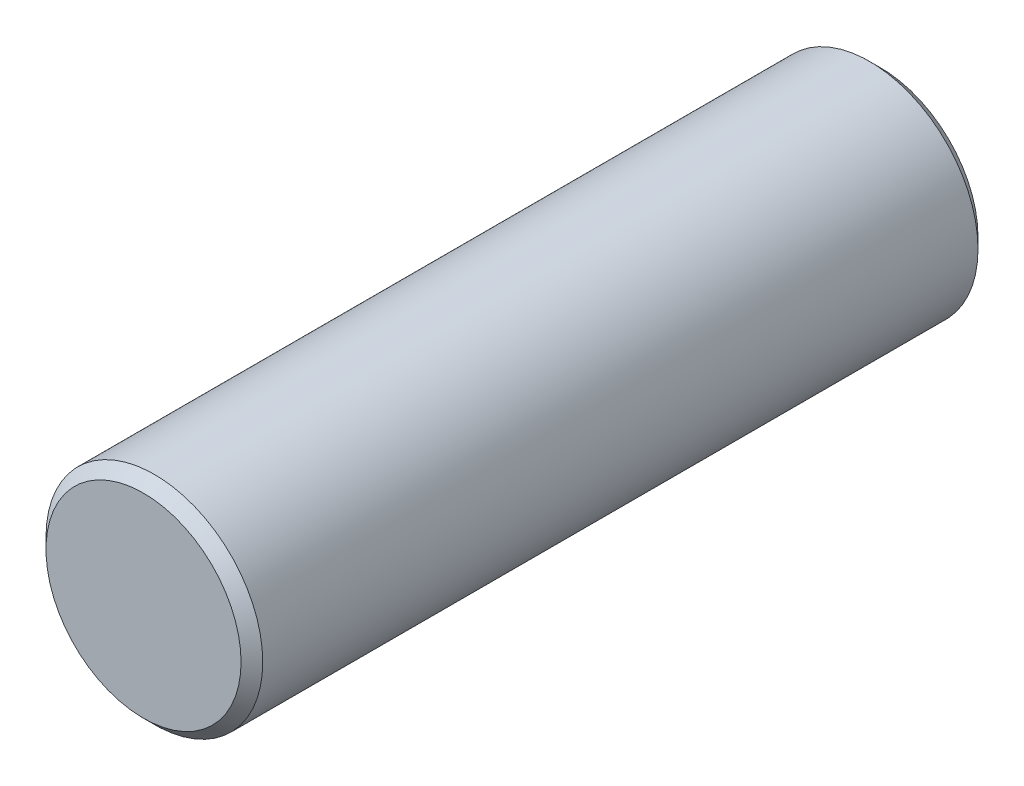
ISO-10303-21;
HEADER;
FILE_DESCRIPTION(('STEP AP214'),'2;1');
FILE_NAME('part.step','',(''),(''),'','','');
FILE_SCHEMA(('AUTOMOTIVE_DESIGN { 1 0 10303 214 1 1 1 1 }'));
ENDSEC;
DATA;
#1=APPLICATION_CONTEXT('core data for automotive mechanical design processes');
#2=APPLICATION_PROTOCOL_DEFINITION('international standard','automotive_design',2000,#1);
#3=PRODUCT_CONTEXT('',#1,'mechanical');
#4=PRODUCT('Part','Part','',(#3));
#5=PRODUCT_RELATED_PRODUCT_CATEGORY('part','',(#4));
#6=PRODUCT_DEFINITION_FORMATION('','',#4);
#7=PRODUCT_DEFINITION_CONTEXT('part definition',#1,'design');
#8=PRODUCT_DEFINITION('design','',#6,#7);
#9=PRODUCT_DEFINITION_SHAPE('','',#8);
#10=(LENGTH_UNIT() NAMED_UNIT(*) SI_UNIT(.MILLI.,.METRE.));
#11=(NAMED_UNIT(*) PLANE_ANGLE_UNIT() SI_UNIT($,.RADIAN.));
#12=(NAMED_UNIT(*) SI_UNIT($,.STERADIAN.) SOLID_ANGLE_UNIT());
#13=UNCERTAINTY_MEASURE_WITH_UNIT(LENGTH_MEASURE(1.E-05),#10,'distance_accuracy_value','');
#14=(GEOMETRIC_REPRESENTATION_CONTEXT(3) GLOBAL_UNCERTAINTY_ASSIGNED_CONTEXT((#13)) GLOBAL_UNIT_ASSIGNED_CONTEXT((#10,
#11,#12)) REPRESENTATION_CONTEXT('',''));
#15=CARTESIAN_POINT('',(0.,0.,0.));
#16=DIRECTION('',(0.,0.,1.));
#17=DIRECTION('',(1.,0.,0.));
#18=AXIS2_PLACEMENT_3D('',#15,#16,#17);
#19=CARTESIAN_POINT('',(0.,0.,25.5));
#20=DIRECTION('',(0.,0.,-1.));
#21=DIRECTION('',(-1.,0.,0.));
#22=AXIS2_PLACEMENT_3D('',#19,#20,#21);
#23=CYLINDRICAL_SURFACE('',#22,7.5);
#24=CARTESIAN_POINT('',(0.,0.,-24.75));
#25=DIRECTION('',(0.,0.,1.));
#26=DIRECTION('',(1.,0.,0.));
#27=AXIS2_PLACEMENT_3D('',#24,#25,#26);
#28=CIRCLE('',#27,7.5);
#29=CARTESIAN_POINT('',(7.5,0.,-24.75));
#30=VERTEX_POINT('',#29);
#31=EDGE_CURVE('E58',#30,#30,#28,.T.);
#32=ORIENTED_EDGE('',*,*,#31,.T.);
#33=EDGE_LOOP('',(#32));
#34=FACE_BOUND('',#33,.T.);
#35=CARTESIAN_POINT('',(0.,0.,24.75));
#36=DIRECTION('',(0.,0.,1.));
#37=DIRECTION('',(1.,0.,0.));
#38=AXIS2_PLACEMENT_3D('',#35,#36,#37);
#39=CIRCLE('',#38,7.5);
#40=CARTESIAN_POINT('',(7.5,0.,24.75));
#41=VERTEX_POINT('',#40);
#42=EDGE_CURVE('E63',#41,#41,#39,.F.);
#43=ORIENTED_EDGE('',*,*,#42,.T.);
#44=EDGE_LOOP('',(#43));
#45=FACE_BOUND('',#44,.T.);
#46=ADVANCED_FACE('F45',(#34,#45),#23,.T.);
#47=CARTESIAN_POINT('',(0.,0.,25.5));
#48=DIRECTION('',(0.,0.,1.));
#49=DIRECTION('',(1.,0.,0.));
#50=AXIS2_PLACEMENT_3D('',#47,#48,#49);
#51=PLANE('',#50);
#52=CARTESIAN_POINT('',(0.,0.,25.5));
#53=DIRECTION('',(0.,0.,1.));
#54=DIRECTION('',(1.,0.,0.));
#55=AXIS2_PLACEMENT_3D('',#52,#53,#54);
#56=CIRCLE('',#55,6.75);
#57=CARTESIAN_POINT('',(6.75,0.,25.5));
#58=VERTEX_POINT('',#57);
#59=EDGE_CURVE('E10',#58,#58,#56,.T.);
#60=ORIENTED_EDGE('',*,*,#59,.T.);
#61=EDGE_LOOP('',(#60));
#62=FACE_BOUND('',#61,.T.);
#63=ADVANCED_FACE('F80',(#62),#51,.T.);
#64=CARTESIAN_POINT('',(0.,0.,-25.5));
#65=DIRECTION('',(0.,0.,1.));
#66=DIRECTION('',(1.,0.,0.));
#67=AXIS2_PLACEMENT_3D('',#64,#65,#66);
#68=PLANE('',#67);
#69=CARTESIAN_POINT('',(0.,0.,-25.5));
#70=DIRECTION('',(0.,0.,1.));
#71=DIRECTION('',(1.,0.,0.));
#72=AXIS2_PLACEMENT_3D('',#69,#70,#71);
#73=CIRCLE('',#72,6.75);
#74=CARTESIAN_POINT('',(6.75,0.,-25.5));
#75=VERTEX_POINT('',#74);
#76=EDGE_CURVE('E53',#75,#75,#73,.F.);
#77=ORIENTED_EDGE('',*,*,#76,.T.);
#78=EDGE_LOOP('',(#77));
#79=FACE_BOUND('',#78,.T.);
#80=ADVANCED_FACE('F77',(#79),#68,.F.);
#81=CARTESIAN_POINT('',(0.,0.,-24.75));
#82=DIRECTION('',(0.,0.,1.));
#83=DIRECTION('',(1.,0.,0.));
#84=AXIS2_PLACEMENT_3D('',#81,#82,#83);
#85=CONICAL_SURFACE('',#84,7.5,0.785398163397457);
#86=ORIENTED_EDGE('',*,*,#76,.F.);
#87=EDGE_LOOP('',(#86));
#88=FACE_BOUND('',#87,.T.);
#89=ORIENTED_EDGE('',*,*,#31,.F.);
#90=EDGE_LOOP('',(#89));
#91=FACE_BOUND('',#90,.T.);
#92=ADVANCED_FACE('F73',(#88,#91),#85,.T.);
#93=CARTESIAN_POINT('',(0.,0.,25.5));
#94=DIRECTION('',(0.,0.,-1.));
#95=DIRECTION('',(-1.,0.,0.));
#96=AXIS2_PLACEMENT_3D('',#93,#94,#95);
#97=CONICAL_SURFACE('',#96,6.75,0.78539816339745);
#98=ORIENTED_EDGE('',*,*,#42,.F.);
#99=EDGE_LOOP('',(#98));
#100=FACE_BOUND('',#99,.T.);
#101=ORIENTED_EDGE('',*,*,#59,.F.);
#102=EDGE_LOOP('',(#101));
#103=FACE_BOUND('',#102,.T.);
#104=ADVANCED_FACE('F47',(#100,#103),#97,.T.);
#105=CLOSED_SHELL('',(#46,#63,#80,#92,#104));
#106=MANIFOLD_SOLID_BREP('B2',#105);
#107=ADVANCED_BREP_SHAPE_REPRESENTATION('',(#18,#106),#14);
#108=SHAPE_DEFINITION_REPRESENTATION(#9,#107);
ENDSEC;
END-ISO-10303-21;
